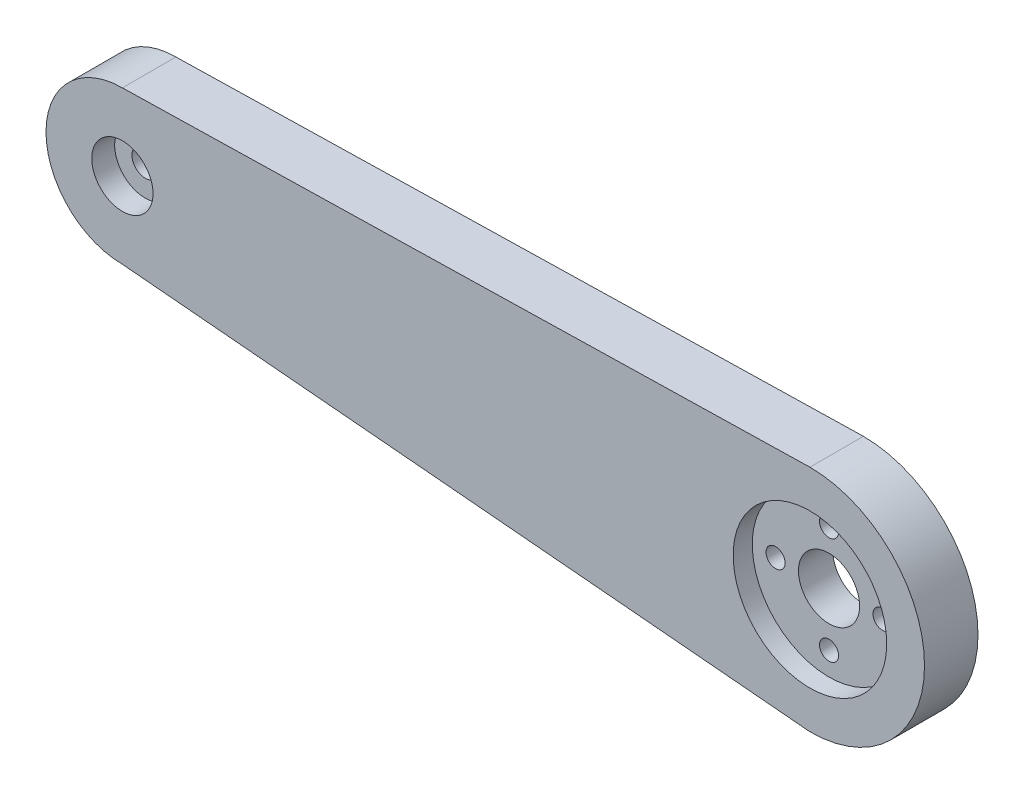
ISO-10303-21;
HEADER;
FILE_DESCRIPTION(('STEP AP214'),'2;1');
FILE_NAME('part.step','',(''),(''),'','','');
FILE_SCHEMA(('AUTOMOTIVE_DESIGN { 1 0 10303 214 1 1 1 1 }'));
ENDSEC;
DATA;
#1=APPLICATION_CONTEXT('core data for automotive mechanical design processes');
#2=APPLICATION_PROTOCOL_DEFINITION('international standard','automotive_design',2000,#1);
#3=PRODUCT_CONTEXT('',#1,'mechanical');
#4=PRODUCT('Part','Part','',(#3));
#5=PRODUCT_RELATED_PRODUCT_CATEGORY('part','',(#4));
#6=PRODUCT_DEFINITION_FORMATION('','',#4);
#7=PRODUCT_DEFINITION_CONTEXT('part definition',#1,'design');
#8=PRODUCT_DEFINITION('design','',#6,#7);
#9=PRODUCT_DEFINITION_SHAPE('','',#8);
#10=(LENGTH_UNIT() NAMED_UNIT(*) SI_UNIT(.MILLI.,.METRE.));
#11=(NAMED_UNIT(*) PLANE_ANGLE_UNIT() SI_UNIT($,.RADIAN.));
#12=(NAMED_UNIT(*) SI_UNIT($,.STERADIAN.) SOLID_ANGLE_UNIT());
#13=UNCERTAINTY_MEASURE_WITH_UNIT(LENGTH_MEASURE(1.E-05),#10,'distance_accuracy_value','');
#14=(GEOMETRIC_REPRESENTATION_CONTEXT(3) GLOBAL_UNCERTAINTY_ASSIGNED_CONTEXT((#13)) GLOBAL_UNIT_ASSIGNED_CONTEXT((#10,
#11,#12)) REPRESENTATION_CONTEXT('',''));
#15=CARTESIAN_POINT('',(0.,0.,0.));
#16=DIRECTION('',(0.,0.,1.));
#17=DIRECTION('',(1.,0.,0.));
#18=AXIS2_PLACEMENT_3D('',#15,#16,#17);
#19=CARTESIAN_POINT('',(90.,-3.00000000000001,10.));
#20=DIRECTION('',(0.,0.,-1.));
#21=DIRECTION('',(-1.,0.,0.));
#22=AXIS2_PLACEMENT_3D('',#19,#20,#21);
#23=CYLINDRICAL_SURFACE('',#22,4.00000000000001);
#24=CARTESIAN_POINT('',(90.,-3.00000000000001,0.));
#25=DIRECTION('',(0.,0.,-1.));
#26=DIRECTION('',(-1.,0.,0.));
#27=AXIS2_PLACEMENT_3D('',#24,#25,#26);
#28=CIRCLE('',#27,4.00000000000001);
#29=CARTESIAN_POINT('',(86.,-3.00000000000001,0.));
#30=VERTEX_POINT('',#29);
#31=EDGE_CURVE('E106',#30,#30,#28,.T.);
#32=ORIENTED_EDGE('',*,*,#31,.T.);
#33=EDGE_LOOP('',(#32));
#34=FACE_BOUND('',#33,.T.);
#35=CARTESIAN_POINT('',(90.,-3.00000000000001,4.5));
#36=DIRECTION('',(0.,0.,1.));
#37=DIRECTION('',(1.,0.,0.));
#38=AXIS2_PLACEMENT_3D('',#35,#36,#37);
#39=CIRCLE('',#38,4.00000000000001);
#40=CARTESIAN_POINT('',(94.,-3.00000000000001,4.5));
#41=VERTEX_POINT('',#40);
#42=EDGE_CURVE('E137',#41,#41,#39,.F.);
#43=ORIENTED_EDGE('',*,*,#42,.F.);
#44=EDGE_LOOP('',(#43));
#45=FACE_BOUND('',#44,.T.);
#46=ADVANCED_FACE('F36',(#34,#45),#23,.F.);
#47=CARTESIAN_POINT('',(90.,3.99999999999999,10.));
#48=DIRECTION('',(0.,0.,-1.));
#49=DIRECTION('',(-1.,0.,0.));
#50=AXIS2_PLACEMENT_3D('',#47,#48,#49);
#51=CYLINDRICAL_SURFACE('',#50,1.25);
#52=CARTESIAN_POINT('',(90.,3.99999999999999,0.));
#53=DIRECTION('',(0.,0.,-1.));
#54=DIRECTION('',(-1.,0.,0.));
#55=AXIS2_PLACEMENT_3D('',#52,#53,#54);
#56=CIRCLE('',#55,1.25);
#57=CARTESIAN_POINT('',(88.75,3.99999999999999,0.));
#58=VERTEX_POINT('',#57);
#59=EDGE_CURVE('E145',#58,#58,#56,.T.);
#60=ORIENTED_EDGE('',*,*,#59,.T.);
#61=EDGE_LOOP('',(#60));
#62=FACE_BOUND('',#61,.T.);
#63=CARTESIAN_POINT('',(90.,3.99999999999999,4.5));
#64=DIRECTION('',(0.,0.,1.));
#65=DIRECTION('',(1.,0.,0.));
#66=AXIS2_PLACEMENT_3D('',#63,#64,#65);
#67=CIRCLE('',#66,1.25);
#68=CARTESIAN_POINT('',(91.25,3.99999999999999,4.5));
#69=VERTEX_POINT('',#68);
#70=EDGE_CURVE('E134',#69,#69,#67,.F.);
#71=ORIENTED_EDGE('',*,*,#70,.F.);
#72=EDGE_LOOP('',(#71));
#73=FACE_BOUND('',#72,.T.);
#74=ADVANCED_FACE('F176',(#62,#73),#51,.F.);
#75=CARTESIAN_POINT('',(83.,-3.00000000000001,10.));
#76=DIRECTION('',(0.,0.,-1.));
#77=DIRECTION('',(-1.,0.,0.));
#78=AXIS2_PLACEMENT_3D('',#75,#76,#77);
#79=CYLINDRICAL_SURFACE('',#78,1.25);
#80=CARTESIAN_POINT('',(83.,-3.00000000000001,0.));
#81=DIRECTION('',(0.,0.,-1.));
#82=DIRECTION('',(-1.,0.,0.));
#83=AXIS2_PLACEMENT_3D('',#80,#81,#82);
#84=CIRCLE('',#83,1.25);
#85=CARTESIAN_POINT('',(81.75,-3.00000000000001,0.));
#86=VERTEX_POINT('',#85);
#87=EDGE_CURVE('E141',#86,#86,#84,.T.);
#88=ORIENTED_EDGE('',*,*,#87,.T.);
#89=EDGE_LOOP('',(#88));
#90=FACE_BOUND('',#89,.T.);
#91=CARTESIAN_POINT('',(83.,-3.00000000000001,4.5));
#92=DIRECTION('',(0.,0.,1.));
#93=DIRECTION('',(1.,0.,0.));
#94=AXIS2_PLACEMENT_3D('',#91,#92,#93);
#95=CIRCLE('',#94,1.25);
#96=CARTESIAN_POINT('',(84.25,-3.00000000000001,4.5));
#97=VERTEX_POINT('',#96);
#98=EDGE_CURVE('E118',#97,#97,#95,.F.);
#99=ORIENTED_EDGE('',*,*,#98,.F.);
#100=EDGE_LOOP('',(#99));
#101=FACE_BOUND('',#100,.T.);
#102=ADVANCED_FACE('F181',(#90,#101),#79,.F.);
#103=CARTESIAN_POINT('',(90.,-10.,10.));
#104=DIRECTION('',(0.,0.,-1.));
#105=DIRECTION('',(-1.,0.,0.));
#106=AXIS2_PLACEMENT_3D('',#103,#104,#105);
#107=CYLINDRICAL_SURFACE('',#106,1.25);
#108=CARTESIAN_POINT('',(90.,-10.,0.));
#109=DIRECTION('',(0.,0.,-1.));
#110=DIRECTION('',(-1.,0.,0.));
#111=AXIS2_PLACEMENT_3D('',#108,#109,#110);
#112=CIRCLE('',#111,1.25);
#113=CARTESIAN_POINT('',(88.75,-10.,0.));
#114=VERTEX_POINT('',#113);
#115=EDGE_CURVE('E144',#114,#114,#112,.T.);
#116=ORIENTED_EDGE('',*,*,#115,.T.);
#117=EDGE_LOOP('',(#116));
#118=FACE_BOUND('',#117,.T.);
#119=CARTESIAN_POINT('',(90.,-10.,4.5));
#120=DIRECTION('',(0.,0.,1.));
#121=DIRECTION('',(1.,0.,0.));
#122=AXIS2_PLACEMENT_3D('',#119,#120,#121);
#123=CIRCLE('',#122,1.25);
#124=CARTESIAN_POINT('',(91.25,-10.,4.5));
#125=VERTEX_POINT('',#124);
#126=EDGE_CURVE('E113',#125,#125,#123,.F.);
#127=ORIENTED_EDGE('',*,*,#126,.F.);
#128=EDGE_LOOP('',(#127));
#129=FACE_BOUND('',#128,.T.);
#130=ADVANCED_FACE('F188',(#118,#129),#107,.F.);
#131=CARTESIAN_POINT('',(97.,-3.,10.));
#132=DIRECTION('',(0.,0.,-1.));
#133=DIRECTION('',(-1.,0.,0.));
#134=AXIS2_PLACEMENT_3D('',#131,#132,#133);
#135=CYLINDRICAL_SURFACE('',#134,1.25);
#136=CARTESIAN_POINT('',(97.,-3.,0.));
#137=DIRECTION('',(0.,0.,-1.));
#138=DIRECTION('',(-1.,0.,0.));
#139=AXIS2_PLACEMENT_3D('',#136,#137,#138);
#140=CIRCLE('',#139,1.25);
#141=CARTESIAN_POINT('',(95.75,-3.,0.));
#142=VERTEX_POINT('',#141);
#143=EDGE_CURVE('E140',#142,#142,#140,.T.);
#144=ORIENTED_EDGE('',*,*,#143,.T.);
#145=EDGE_LOOP('',(#144));
#146=FACE_BOUND('',#145,.T.);
#147=CARTESIAN_POINT('',(97.,-3.,4.5));
#148=DIRECTION('',(0.,0.,1.));
#149=DIRECTION('',(1.,0.,0.));
#150=AXIS2_PLACEMENT_3D('',#147,#148,#149);
#151=CIRCLE('',#150,1.25);
#152=CARTESIAN_POINT('',(98.25,-3.,4.5));
#153=VERTEX_POINT('',#152);
#154=EDGE_CURVE('E111',#153,#153,#151,.F.);
#155=ORIENTED_EDGE('',*,*,#154,.F.);
#156=EDGE_LOOP('',(#155));
#157=FACE_BOUND('',#156,.T.);
#158=ADVANCED_FACE('F185',(#146,#157),#135,.F.);
#159=CARTESIAN_POINT('',(0.,0.,7.));
#160=DIRECTION('',(0.,0.,-1.));
#161=DIRECTION('',(-1.,0.,0.));
#162=AXIS2_PLACEMENT_3D('',#159,#160,#161);
#163=CYLINDRICAL_SURFACE('',#162,10.);
#164=CARTESIAN_POINT('',(0.,0.,0.));
#165=DIRECTION('',(0.,0.,1.));
#166=DIRECTION('',(1.,0.,0.));
#167=AXIS2_PLACEMENT_3D('',#164,#165,#166);
#168=CIRCLE('',#167,10.);
#169=CARTESIAN_POINT('',(0.,10.,0.));
#170=VERTEX_POINT('',#169);
#171=CARTESIAN_POINT('',(0.,-10.,0.));
#172=VERTEX_POINT('',#171);
#173=EDGE_CURVE('E103',#170,#172,#168,.T.);
#174=ORIENTED_EDGE('',*,*,#173,.T.);
#175=DIRECTION('',(0.,0.,-1.));
#176=VECTOR('',#175,1.);
#177=CARTESIAN_POINT('',(0.,-10.,7.));
#178=LINE('',#177,#176);
#179=CARTESIAN_POINT('',(0.,-10.,7.));
#180=VERTEX_POINT('',#179);
#181=EDGE_CURVE('E11',#180,#172,#178,.T.);
#182=ORIENTED_EDGE('',*,*,#181,.F.);
#183=CARTESIAN_POINT('',(0.,0.,7.));
#184=DIRECTION('',(0.,0.,1.));
#185=DIRECTION('',(1.,0.,0.));
#186=AXIS2_PLACEMENT_3D('',#183,#184,#185);
#187=CIRCLE('',#186,10.);
#188=CARTESIAN_POINT('',(0.,10.,7.));
#189=VERTEX_POINT('',#188);
#190=EDGE_CURVE('E90',#189,#180,#187,.T.);
#191=ORIENTED_EDGE('',*,*,#190,.F.);
#192=DIRECTION('',(0.,0.,-1.));
#193=VECTOR('',#192,1.);
#194=CARTESIAN_POINT('',(0.,10.,7.));
#195=LINE('',#194,#193);
#196=EDGE_CURVE('E99',#189,#170,#195,.T.);
#197=ORIENTED_EDGE('',*,*,#196,.T.);
#198=EDGE_LOOP('',(#174,#182,#191,#197));
#199=FACE_BOUND('',#198,.T.);
#200=ADVANCED_FACE('F38',(#199),#163,.T.);
#201=CARTESIAN_POINT('',(0.,-10.,7.));
#202=DIRECTION('',(0.0885397902837944,0.996072640692687,0.));
#203=DIRECTION('',(-0.996072640692687,0.0885397902837944,0.));
#204=AXIS2_PLACEMENT_3D('',#201,#202,#203);
#205=PLANE('',#204);
#206=DIRECTION('',(0.996072640692687,-0.0885397902837944,0.));
#207=VECTOR('',#206,1.);
#208=CARTESIAN_POINT('',(0.,-10.,0.));
#209=LINE('',#208,#207);
#210=CARTESIAN_POINT('',(90.,-18.,0.));
#211=VERTEX_POINT('',#210);
#212=EDGE_CURVE('E94',#172,#211,#209,.T.);
#213=ORIENTED_EDGE('',*,*,#212,.T.);
#214=DIRECTION('',(0.,0.,-1.));
#215=VECTOR('',#214,1.);
#216=CARTESIAN_POINT('',(90.,-18.,7.));
#217=LINE('',#216,#215);
#218=CARTESIAN_POINT('',(90.,-18.,7.));
#219=VERTEX_POINT('',#218);
#220=EDGE_CURVE('E46',#219,#211,#217,.T.);
#221=ORIENTED_EDGE('',*,*,#220,.F.);
#222=DIRECTION('',(0.996072640692687,-0.0885397902837944,0.));
#223=VECTOR('',#222,1.);
#224=CARTESIAN_POINT('',(0.,-10.,7.));
#225=LINE('',#224,#223);
#226=EDGE_CURVE('E85',#180,#219,#225,.T.);
#227=ORIENTED_EDGE('',*,*,#226,.F.);
#228=ORIENTED_EDGE('',*,*,#181,.T.);
#229=EDGE_LOOP('',(#213,#221,#227,#228));
#230=FACE_BOUND('',#229,.T.);
#231=ADVANCED_FACE('F93',(#230),#205,.F.);
#232=CARTESIAN_POINT('',(90.,-3.00000000000001,7.));
#233=DIRECTION('',(0.,0.,-1.));
#234=DIRECTION('',(-1.,0.,0.));
#235=AXIS2_PLACEMENT_3D('',#232,#233,#234);
#236=CYLINDRICAL_SURFACE('',#235,15.);
#237=CARTESIAN_POINT('',(90.,-3.00000000000001,0.));
#238=DIRECTION('',(0.,0.,1.));
#239=DIRECTION('',(1.,0.,0.));
#240=AXIS2_PLACEMENT_3D('',#237,#238,#239);
#241=CIRCLE('',#240,15.);
#242=CARTESIAN_POINT('',(90.,12.,0.));
#243=VERTEX_POINT('',#242);
#244=EDGE_CURVE('E72',#211,#243,#241,.T.);
#245=ORIENTED_EDGE('',*,*,#244,.T.);
#246=DIRECTION('',(0.,0.,-1.));
#247=VECTOR('',#246,1.);
#248=CARTESIAN_POINT('',(90.,12.,7.));
#249=LINE('',#248,#247);
#250=CARTESIAN_POINT('',(90.,12.,7.));
#251=VERTEX_POINT('',#250);
#252=EDGE_CURVE('E95',#251,#243,#249,.T.);
#253=ORIENTED_EDGE('',*,*,#252,.F.);
#254=CARTESIAN_POINT('',(90.,-3.00000000000001,7.));
#255=DIRECTION('',(0.,0.,1.));
#256=DIRECTION('',(1.,0.,0.));
#257=AXIS2_PLACEMENT_3D('',#254,#255,#256);
#258=CIRCLE('',#257,15.);
#259=EDGE_CURVE('E88',#219,#251,#258,.T.);
#260=ORIENTED_EDGE('',*,*,#259,.F.);
#261=ORIENTED_EDGE('',*,*,#220,.T.);
#262=EDGE_LOOP('',(#245,#253,#260,#261));
#263=FACE_BOUND('',#262,.T.);
#264=ADVANCED_FACE('F97',(#263),#236,.T.);
#265=CARTESIAN_POINT('',(0.,10.,7.));
#266=DIRECTION('',(0.0222167372851468,-0.99975317783161,0.));
#267=DIRECTION('',(0.99975317783161,0.0222167372851468,0.));
#268=AXIS2_PLACEMENT_3D('',#265,#266,#267);
#269=PLANE('',#268);
#270=DIRECTION('',(-0.99975317783161,-0.0222167372851468,0.));
#271=VECTOR('',#270,1.);
#272=CARTESIAN_POINT('',(0.,10.,0.));
#273=LINE('',#272,#271);
#274=EDGE_CURVE('E78',#243,#170,#273,.T.);
#275=ORIENTED_EDGE('',*,*,#274,.T.);
#276=ORIENTED_EDGE('',*,*,#196,.F.);
#277=DIRECTION('',(-0.99975317783161,-0.0222167372851468,0.));
#278=VECTOR('',#277,1.);
#279=CARTESIAN_POINT('',(0.,10.,7.));
#280=LINE('',#279,#278);
#281=EDGE_CURVE('E55',#251,#189,#280,.T.);
#282=ORIENTED_EDGE('',*,*,#281,.F.);
#283=ORIENTED_EDGE('',*,*,#252,.T.);
#284=EDGE_LOOP('',(#275,#276,#282,#283));
#285=FACE_BOUND('',#284,.T.);
#286=ADVANCED_FACE('F165',(#285),#269,.F.);
#287=CARTESIAN_POINT('',(0.,0.,7.));
#288=DIRECTION('',(0.,0.,1.));
#289=DIRECTION('',(1.,0.,0.));
#290=AXIS2_PLACEMENT_3D('',#287,#288,#289);
#291=PLANE('',#290);
#292=CARTESIAN_POINT('',(0.,0.,7.));
#293=DIRECTION('',(0.,0.,1.));
#294=DIRECTION('',(1.,0.,0.));
#295=AXIS2_PLACEMENT_3D('',#292,#293,#294);
#296=CIRCLE('',#295,4.01);
#297=CARTESIAN_POINT('',(4.01,0.,7.));
#298=VERTEX_POINT('',#297);
#299=EDGE_CURVE('E129',#298,#298,#296,.T.);
#300=ORIENTED_EDGE('',*,*,#299,.F.);
#301=EDGE_LOOP('',(#300));
#302=FACE_BOUND('',#301,.T.);
#303=CARTESIAN_POINT('',(90.,-3.00000000000001,7.));
#304=DIRECTION('',(0.,0.,1.));
#305=DIRECTION('',(1.,0.,0.));
#306=AXIS2_PLACEMENT_3D('',#303,#304,#305);
#307=CIRCLE('',#306,10.05);
#308=CARTESIAN_POINT('',(100.05,-3.00000000000001,7.));
#309=VERTEX_POINT('',#308);
#310=EDGE_CURVE('E121',#309,#309,#307,.T.);
#311=ORIENTED_EDGE('',*,*,#310,.F.);
#312=EDGE_LOOP('',(#311));
#313=FACE_BOUND('',#312,.T.);
#314=ORIENTED_EDGE('',*,*,#190,.T.);
#315=ORIENTED_EDGE('',*,*,#226,.T.);
#316=ORIENTED_EDGE('',*,*,#259,.T.);
#317=ORIENTED_EDGE('',*,*,#281,.T.);
#318=EDGE_LOOP('',(#314,#315,#316,#317));
#319=FACE_BOUND('',#318,.T.);
#320=ADVANCED_FACE('F86',(#302,#313,#319),#291,.T.);
#321=CARTESIAN_POINT('',(0.,0.,0.));
#322=DIRECTION('',(0.,0.,1.));
#323=DIRECTION('',(1.,0.,0.));
#324=AXIS2_PLACEMENT_3D('',#321,#322,#323);
#325=PLANE('',#324);
#326=CARTESIAN_POINT('',(0.,0.,0.));
#327=DIRECTION('',(0.,0.,-1.));
#328=DIRECTION('',(-1.,0.,0.));
#329=AXIS2_PLACEMENT_3D('',#326,#327,#328);
#330=CIRCLE('',#329,1.75);
#331=CARTESIAN_POINT('',(-1.75,0.,0.));
#332=VERTEX_POINT('',#331);
#333=EDGE_CURVE('E220',#332,#332,#330,.T.);
#334=ORIENTED_EDGE('',*,*,#333,.F.);
#335=EDGE_LOOP('',(#334));
#336=FACE_BOUND('',#335,.T.);
#337=ORIENTED_EDGE('',*,*,#143,.F.);
#338=EDGE_LOOP('',(#337));
#339=FACE_BOUND('',#338,.T.);
#340=ORIENTED_EDGE('',*,*,#115,.F.);
#341=EDGE_LOOP('',(#340));
#342=FACE_BOUND('',#341,.T.);
#343=ORIENTED_EDGE('',*,*,#87,.F.);
#344=EDGE_LOOP('',(#343));
#345=FACE_BOUND('',#344,.T.);
#346=ORIENTED_EDGE('',*,*,#59,.F.);
#347=EDGE_LOOP('',(#346));
#348=FACE_BOUND('',#347,.T.);
#349=ORIENTED_EDGE('',*,*,#31,.F.);
#350=EDGE_LOOP('',(#349));
#351=FACE_BOUND('',#350,.T.);
#352=ORIENTED_EDGE('',*,*,#173,.F.);
#353=ORIENTED_EDGE('',*,*,#274,.F.);
#354=ORIENTED_EDGE('',*,*,#244,.F.);
#355=ORIENTED_EDGE('',*,*,#212,.F.);
#356=EDGE_LOOP('',(#352,#353,#354,#355));
#357=FACE_BOUND('',#356,.T.);
#358=ADVANCED_FACE('F157',(#336,#339,#342,#345,#348,#351,#357),#325,.F.);
#359=CARTESIAN_POINT('',(90.,-3.00000000000001,4.5));
#360=DIRECTION('',(0.,0.,1.));
#361=DIRECTION('',(1.,0.,0.));
#362=AXIS2_PLACEMENT_3D('',#359,#360,#361);
#363=PLANE('',#362);
#364=CARTESIAN_POINT('',(90.,-3.00000000000001,4.5));
#365=DIRECTION('',(0.,0.,1.));
#366=DIRECTION('',(1.,0.,0.));
#367=AXIS2_PLACEMENT_3D('',#364,#365,#366);
#368=CIRCLE('',#367,10.05);
#369=CARTESIAN_POINT('',(100.05,-3.00000000000001,4.5));
#370=VERTEX_POINT('',#369);
#371=EDGE_CURVE('E114',#370,#370,#368,.T.);
#372=ORIENTED_EDGE('',*,*,#371,.T.);
#373=EDGE_LOOP('',(#372));
#374=FACE_BOUND('',#373,.T.);
#375=ORIENTED_EDGE('',*,*,#154,.T.);
#376=EDGE_LOOP('',(#375));
#377=FACE_BOUND('',#376,.T.);
#378=ORIENTED_EDGE('',*,*,#126,.T.);
#379=EDGE_LOOP('',(#378));
#380=FACE_BOUND('',#379,.T.);
#381=ORIENTED_EDGE('',*,*,#98,.T.);
#382=EDGE_LOOP('',(#381));
#383=FACE_BOUND('',#382,.T.);
#384=ORIENTED_EDGE('',*,*,#70,.T.);
#385=EDGE_LOOP('',(#384));
#386=FACE_BOUND('',#385,.T.);
#387=ORIENTED_EDGE('',*,*,#42,.T.);
#388=EDGE_LOOP('',(#387));
#389=FACE_BOUND('',#388,.T.);
#390=ADVANCED_FACE('F160',(#374,#377,#380,#383,#386,#389),#363,.T.);
#391=CARTESIAN_POINT('',(90.,-3.00000000000001,4.5));
#392=DIRECTION('',(0.,0.,1.));
#393=DIRECTION('',(1.,0.,0.));
#394=AXIS2_PLACEMENT_3D('',#391,#392,#393);
#395=CYLINDRICAL_SURFACE('',#394,10.05);
#396=ORIENTED_EDGE('',*,*,#371,.F.);
#397=EDGE_LOOP('',(#396));
#398=FACE_BOUND('',#397,.T.);
#399=ORIENTED_EDGE('',*,*,#310,.T.);
#400=EDGE_LOOP('',(#399));
#401=FACE_BOUND('',#400,.T.);
#402=ADVANCED_FACE('F196',(#398,#401),#395,.F.);
#403=CARTESIAN_POINT('',(0.,0.,4.));
#404=DIRECTION('',(0.,0.,1.));
#405=DIRECTION('',(1.,0.,0.));
#406=AXIS2_PLACEMENT_3D('',#403,#404,#405);
#407=CYLINDRICAL_SURFACE('',#406,4.01);
#408=CARTESIAN_POINT('',(0.,0.,4.));
#409=DIRECTION('',(0.,0.,1.));
#410=DIRECTION('',(1.,0.,0.));
#411=AXIS2_PLACEMENT_3D('',#408,#409,#410);
#412=CIRCLE('',#411,4.01);
#413=CARTESIAN_POINT('',(4.01,0.,4.));
#414=VERTEX_POINT('',#413);
#415=EDGE_CURVE('E126',#414,#414,#412,.T.);
#416=ORIENTED_EDGE('',*,*,#415,.F.);
#417=EDGE_LOOP('',(#416));
#418=FACE_BOUND('',#417,.T.);
#419=ORIENTED_EDGE('',*,*,#299,.T.);
#420=EDGE_LOOP('',(#419));
#421=FACE_BOUND('',#420,.T.);
#422=ADVANCED_FACE('F199',(#418,#421),#407,.F.);
#423=CARTESIAN_POINT('',(0.,0.,4.));
#424=DIRECTION('',(0.,0.,1.));
#425=DIRECTION('',(1.,0.,0.));
#426=AXIS2_PLACEMENT_3D('',#423,#424,#425);
#427=PLANE('',#426);
#428=CARTESIAN_POINT('',(0.,0.,4.));
#429=DIRECTION('',(0.,0.,1.));
#430=DIRECTION('',(1.,0.,0.));
#431=AXIS2_PLACEMENT_3D('',#428,#429,#430);
#432=CIRCLE('',#431,1.75);
#433=CARTESIAN_POINT('',(1.75,0.,4.));
#434=VERTEX_POINT('',#433);
#435=EDGE_CURVE('E40',#434,#434,#432,.T.);
#436=ORIENTED_EDGE('',*,*,#435,.F.);
#437=EDGE_LOOP('',(#436));
#438=FACE_BOUND('',#437,.T.);
#439=ORIENTED_EDGE('',*,*,#415,.T.);
#440=EDGE_LOOP('',(#439));
#441=FACE_BOUND('',#440,.T.);
#442=ADVANCED_FACE('F205',(#438,#441),#427,.T.);
#443=CARTESIAN_POINT('',(0.,0.,10.));
#444=DIRECTION('',(0.,0.,-1.));
#445=DIRECTION('',(-1.,0.,0.));
#446=AXIS2_PLACEMENT_3D('',#443,#444,#445);
#447=CYLINDRICAL_SURFACE('',#446,1.75);
#448=ORIENTED_EDGE('',*,*,#435,.T.);
#449=EDGE_LOOP('',(#448));
#450=FACE_BOUND('',#449,.T.);
#451=ORIENTED_EDGE('',*,*,#333,.T.);
#452=EDGE_LOOP('',(#451));
#453=FACE_BOUND('',#452,.T.);
#454=ADVANCED_FACE('F209',(#450,#453),#447,.F.);
#455=CLOSED_SHELL('',(#46,#74,#102,#130,#158,#200,#231,#264,#286,#320,#358,#390,#402,#422,#442,#454));
#456=MANIFOLD_SOLID_BREP('B2',#455);
#457=ADVANCED_BREP_SHAPE_REPRESENTATION('',(#18,#456),#14);
#458=SHAPE_DEFINITION_REPRESENTATION(#9,#457);
ENDSEC;
END-ISO-10303-21;
